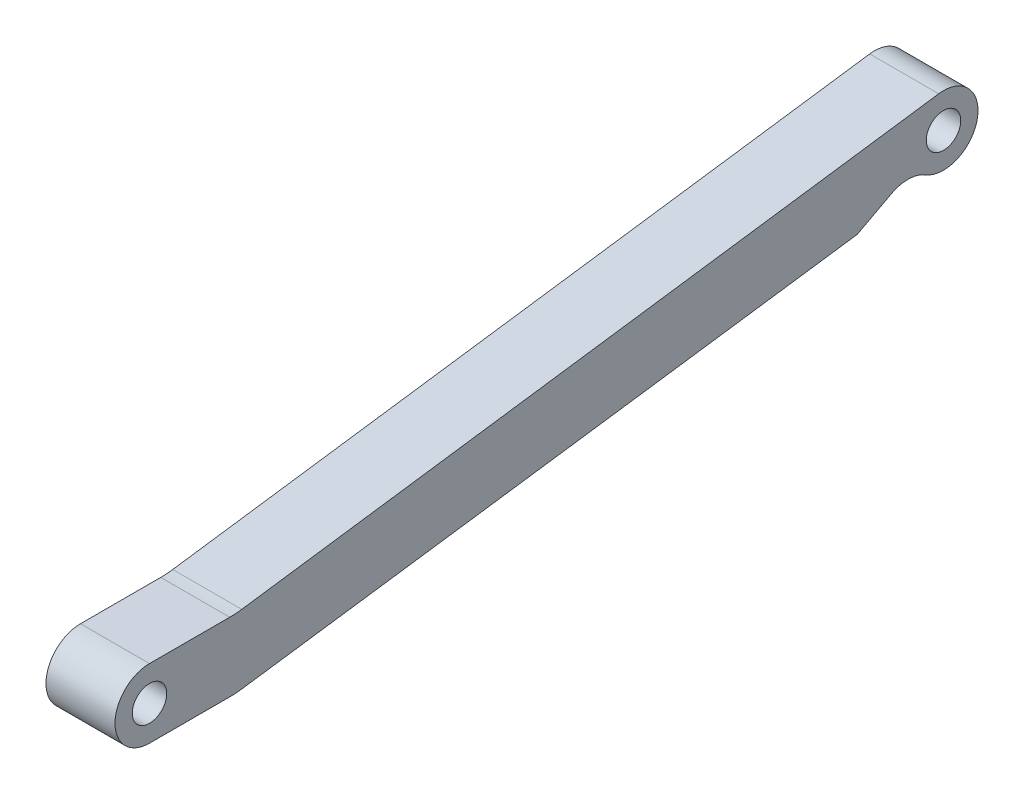
ISO-10303-21;
HEADER;
FILE_DESCRIPTION(('STEP AP214'),'2;1');
FILE_NAME('part.step','',(''),(''),'','','');
FILE_SCHEMA(('AUTOMOTIVE_DESIGN { 1 0 10303 214 1 1 1 1 }'));
ENDSEC;
DATA;
#1=APPLICATION_CONTEXT('core data for automotive mechanical design processes');
#2=APPLICATION_PROTOCOL_DEFINITION('international standard','automotive_design',2000,#1);
#3=PRODUCT_CONTEXT('',#1,'mechanical');
#4=PRODUCT('Part','Part','',(#3));
#5=PRODUCT_RELATED_PRODUCT_CATEGORY('part','',(#4));
#6=PRODUCT_DEFINITION_FORMATION('','',#4);
#7=PRODUCT_DEFINITION_CONTEXT('part definition',#1,'design');
#8=PRODUCT_DEFINITION('design','',#6,#7);
#9=PRODUCT_DEFINITION_SHAPE('','',#8);
#10=(LENGTH_UNIT() NAMED_UNIT(*) SI_UNIT(.MILLI.,.METRE.));
#11=(NAMED_UNIT(*) PLANE_ANGLE_UNIT() SI_UNIT($,.RADIAN.));
#12=(NAMED_UNIT(*) SI_UNIT($,.STERADIAN.) SOLID_ANGLE_UNIT());
#13=UNCERTAINTY_MEASURE_WITH_UNIT(LENGTH_MEASURE(1.E-05),#10,'distance_accuracy_value','');
#14=(GEOMETRIC_REPRESENTATION_CONTEXT(3) GLOBAL_UNCERTAINTY_ASSIGNED_CONTEXT((#13)) GLOBAL_UNIT_ASSIGNED_CONTEXT((#10,
#11,#12)) REPRESENTATION_CONTEXT('',''));
#15=CARTESIAN_POINT('',(0.,0.,0.));
#16=DIRECTION('',(0.,0.,1.));
#17=DIRECTION('',(1.,0.,0.));
#18=AXIS2_PLACEMENT_3D('',#15,#16,#17);
#19=CARTESIAN_POINT('',(-2.,-1.67510815917789,-43.9613905743819));
#20=DIRECTION('',(1.,0.,0.));
#21=DIRECTION('',(0.,0.,-1.));
#22=AXIS2_PLACEMENT_3D('',#19,#20,#21);
#23=CYLINDRICAL_SURFACE('',#22,2.);
#24=DIRECTION('',(1.,0.,0.));
#25=VECTOR('',#24,1.);
#26=CARTESIAN_POINT('',(-2.,0.037445920411055,-44.9944242255682));
#27=LINE('',#26,#25);
#28=CARTESIAN_POINT('',(-2.,0.037445920411055,-44.9944242255682));
#29=VERTEX_POINT('',#28);
#30=CARTESIAN_POINT('',(2.,0.037445920411055,-44.9944242255682));
#31=VERTEX_POINT('',#30);
#32=EDGE_CURVE('E41',#29,#31,#27,.T.);
#33=ORIENTED_EDGE('',*,*,#32,.T.);
#34=CARTESIAN_POINT('',(2.,-1.67510815917789,-43.9613905743819));
#35=DIRECTION('',(1.,0.,0.));
#36=DIRECTION('',(0.,0.,-1.));
#37=AXIS2_PLACEMENT_3D('',#34,#35,#36);
#38=CIRCLE('',#37,2.);
#39=CARTESIAN_POINT('',(2.,0.09158203920933,-43.0239441796891));
#40=VERTEX_POINT('',#39);
#41=EDGE_CURVE('E118',#31,#40,#38,.T.);
#42=ORIENTED_EDGE('',*,*,#41,.T.);
#43=DIRECTION('',(1.,0.,0.));
#44=VECTOR('',#43,1.);
#45=CARTESIAN_POINT('',(-2.,0.09158203920933,-43.0239441796891));
#46=LINE('',#45,#44);
#47=CARTESIAN_POINT('',(-2.,0.09158203920933,-43.0239441796891));
#48=VERTEX_POINT('',#47);
#49=EDGE_CURVE('E11',#48,#40,#46,.T.);
#50=ORIENTED_EDGE('',*,*,#49,.F.);
#51=CARTESIAN_POINT('',(-2.,-1.67510815917789,-43.9613905743819));
#52=DIRECTION('',(1.,0.,0.));
#53=DIRECTION('',(0.,0.,-1.));
#54=AXIS2_PLACEMENT_3D('',#51,#52,#53);
#55=CIRCLE('',#54,2.);
#56=EDGE_CURVE('E54',#29,#48,#55,.T.);
#57=ORIENTED_EDGE('',*,*,#56,.F.);
#58=EDGE_LOOP('',(#33,#42,#50,#57));
#59=FACE_BOUND('',#58,.T.);
#60=ADVANCED_FACE('F38',(#59),#23,.F.);
#61=CARTESIAN_POINT('',(-2.,-17.7423592062854,-9.41450328216023));
#62=DIRECTION('',(0.,-0.88334509919361,-0.468723197346398));
#63=DIRECTION('',(0.,0.468723197346398,-0.88334509919361));
#64=AXIS2_PLACEMENT_3D('',#61,#62,#63);
#65=PLANE('',#64);
#66=ORIENTED_EDGE('',*,*,#49,.T.);
#67=DIRECTION('',(0.,0.468723197346398,-0.88334509919361));
#68=VECTOR('',#67,1.);
#69=CARTESIAN_POINT('',(2.,-17.7423592062854,-9.41450328216023));
#70=LINE('',#69,#68);
#71=CARTESIAN_POINT('',(2.,-0.967799446264573,-41.0274578767545));
#72=VERTEX_POINT('',#71);
#73=EDGE_CURVE('E136',#72,#40,#70,.T.);
#74=ORIENTED_EDGE('',*,*,#73,.F.);
#75=DIRECTION('',(1.,0.,0.));
#76=VECTOR('',#75,1.);
#77=CARTESIAN_POINT('',(-2.,-0.967799446264573,-41.0274578767545));
#78=LINE('',#77,#76);
#79=CARTESIAN_POINT('',(-2.,-0.967799446264573,-41.0274578767545));
#80=VERTEX_POINT('',#79);
#81=EDGE_CURVE('E46',#80,#72,#78,.T.);
#82=ORIENTED_EDGE('',*,*,#81,.F.);
#83=DIRECTION('',(0.,0.468723197346398,-0.88334509919361));
#84=VECTOR('',#83,1.);
#85=CARTESIAN_POINT('',(-2.,-17.7423592062854,-9.41450328216023));
#86=LINE('',#85,#84);
#87=EDGE_CURVE('E184',#80,#48,#86,.T.);
#88=ORIENTED_EDGE('',*,*,#87,.T.);
#89=EDGE_LOOP('',(#66,#74,#82,#88));
#90=FACE_BOUND('',#89,.T.);
#91=ADVANCED_FACE('F233',(#90),#65,.T.);
#92=CARTESIAN_POINT('',(-2.,-6.57020197806449,-0.91770488346063));
#93=DIRECTION('',(0.,-0.990385646456113,-0.138333912305362));
#94=DIRECTION('',(0.,0.138333912305362,-0.990385646456113));
#95=AXIS2_PLACEMENT_3D('',#92,#93,#94);
#96=PLANE('',#95);
#97=ORIENTED_EDGE('',*,*,#81,.T.);
#98=DIRECTION('',(0.,0.138333912305362,-0.990385646456113));
#99=VECTOR('',#98,1.);
#100=CARTESIAN_POINT('',(2.,-6.57020197806449,-0.91770488346063));
#101=LINE('',#100,#99);
#102=CARTESIAN_POINT('',(2.,-5.95192823228057,-5.34416426135625));
#103=VERTEX_POINT('',#102);
#104=EDGE_CURVE('E155',#103,#72,#101,.T.);
#105=ORIENTED_EDGE('',*,*,#104,.F.);
#106=DIRECTION('',(1.,0.,0.));
#107=VECTOR('',#106,1.);
#108=CARTESIAN_POINT('',(-2.,-5.95192823228057,-5.34416426135625));
#109=LINE('',#108,#107);
#110=CARTESIAN_POINT('',(-2.,-5.95192823228057,-5.34416426135625));
#111=VERTEX_POINT('',#110);
#112=EDGE_CURVE('E192',#111,#103,#109,.T.);
#113=ORIENTED_EDGE('',*,*,#112,.F.);
#114=DIRECTION('',(0.,0.138333912305362,-0.990385646456113));
#115=VECTOR('',#114,1.);
#116=CARTESIAN_POINT('',(-2.,-6.57020197806449,-0.91770488346063));
#117=LINE('',#116,#115);
#118=EDGE_CURVE('E182',#111,#80,#117,.T.);
#119=ORIENTED_EDGE('',*,*,#118,.T.);
#120=EDGE_LOOP('',(#97,#105,#113,#119));
#121=FACE_BOUND('',#120,.T.);
#122=ADVANCED_FACE('F231',(#121),#96,.T.);
#123=CARTESIAN_POINT('',(-2.,-1.,-4.65249469982944));
#124=DIRECTION('',(1.,0.,0.));
#125=DIRECTION('',(0.,0.,-1.));
#126=AXIS2_PLACEMENT_3D('',#123,#124,#125);
#127=CYLINDRICAL_SURFACE('',#126,5.);
#128=ORIENTED_EDGE('',*,*,#112,.T.);
#129=CARTESIAN_POINT('',(2.,-1.,-4.65249469982944));
#130=DIRECTION('',(1.,0.,0.));
#131=DIRECTION('',(0.,0.,-1.));
#132=AXIS2_PLACEMENT_3D('',#129,#130,#131);
#133=CIRCLE('',#132,5.);
#134=CARTESIAN_POINT('',(2.,-6.,-4.65249469982944));
#135=VERTEX_POINT('',#134);
#136=EDGE_CURVE('E152',#135,#103,#133,.T.);
#137=ORIENTED_EDGE('',*,*,#136,.F.);
#138=DIRECTION('',(1.,0.,0.));
#139=VECTOR('',#138,1.);
#140=CARTESIAN_POINT('',(-2.,-6.,-4.65249469982944));
#141=LINE('',#140,#139);
#142=CARTESIAN_POINT('',(-2.,-6.,-4.65249469982944));
#143=VERTEX_POINT('',#142);
#144=EDGE_CURVE('E194',#143,#135,#141,.T.);
#145=ORIENTED_EDGE('',*,*,#144,.F.);
#146=CARTESIAN_POINT('',(-2.,-1.,-4.65249469982944));
#147=DIRECTION('',(1.,0.,0.));
#148=DIRECTION('',(0.,0.,-1.));
#149=AXIS2_PLACEMENT_3D('',#146,#147,#148);
#150=CIRCLE('',#149,5.);
#151=EDGE_CURVE('E179',#143,#111,#150,.T.);
#152=ORIENTED_EDGE('',*,*,#151,.T.);
#153=EDGE_LOOP('',(#128,#137,#145,#152));
#154=FACE_BOUND('',#153,.T.);
#155=ADVANCED_FACE('F226',(#154),#127,.T.);
#156=CARTESIAN_POINT('',(-2.,-6.,0.));
#157=DIRECTION('',(0.,-1.,0.));
#158=DIRECTION('',(0.,0.,-1.));
#159=AXIS2_PLACEMENT_3D('',#156,#157,#158);
#160=PLANE('',#159);
#161=ORIENTED_EDGE('',*,*,#144,.T.);
#162=DIRECTION('',(0.,0.,-1.));
#163=VECTOR('',#162,1.);
#164=CARTESIAN_POINT('',(2.,-6.,0.));
#165=LINE('',#164,#163);
#166=CARTESIAN_POINT('',(2.,-6.,0.));
#167=VERTEX_POINT('',#166);
#168=EDGE_CURVE('E149',#167,#135,#165,.T.);
#169=ORIENTED_EDGE('',*,*,#168,.F.);
#170=DIRECTION('',(1.,0.,0.));
#171=VECTOR('',#170,1.);
#172=CARTESIAN_POINT('',(-2.,-6.,0.));
#173=LINE('',#172,#171);
#174=CARTESIAN_POINT('',(-2.,-6.,0.));
#175=VERTEX_POINT('',#174);
#176=EDGE_CURVE('E196',#175,#167,#173,.T.);
#177=ORIENTED_EDGE('',*,*,#176,.F.);
#178=DIRECTION('',(0.,0.,-1.));
#179=VECTOR('',#178,1.);
#180=CARTESIAN_POINT('',(-2.,-6.,0.));
#181=LINE('',#180,#179);
#182=EDGE_CURVE('E176',#175,#143,#181,.T.);
#183=ORIENTED_EDGE('',*,*,#182,.T.);
#184=EDGE_LOOP('',(#161,#169,#177,#183));
#185=FACE_BOUND('',#184,.T.);
#186=ADVANCED_FACE('F222',(#185),#160,.T.);
#187=CARTESIAN_POINT('',(-2.,-4.,0.));
#188=DIRECTION('',(1.,0.,0.));
#189=DIRECTION('',(0.,0.,-1.));
#190=AXIS2_PLACEMENT_3D('',#187,#188,#189);
#191=CYLINDRICAL_SURFACE('',#190,2.);
#192=ORIENTED_EDGE('',*,*,#176,.T.);
#193=CARTESIAN_POINT('',(2.,-4.,0.));
#194=DIRECTION('',(1.,0.,0.));
#195=DIRECTION('',(0.,0.,-1.));
#196=AXIS2_PLACEMENT_3D('',#193,#194,#195);
#197=CIRCLE('',#196,2.);
#198=CARTESIAN_POINT('',(2.,-2.,0.));
#199=VERTEX_POINT('',#198);
#200=EDGE_CURVE('E146',#199,#167,#197,.T.);
#201=ORIENTED_EDGE('',*,*,#200,.F.);
#202=DIRECTION('',(1.,0.,0.));
#203=VECTOR('',#202,1.);
#204=CARTESIAN_POINT('',(-2.,-2.,0.));
#205=LINE('',#204,#203);
#206=CARTESIAN_POINT('',(-2.,-2.,0.));
#207=VERTEX_POINT('',#206);
#208=EDGE_CURVE('E198',#207,#199,#205,.T.);
#209=ORIENTED_EDGE('',*,*,#208,.F.);
#210=CARTESIAN_POINT('',(-2.,-4.,0.));
#211=DIRECTION('',(1.,0.,0.));
#212=DIRECTION('',(0.,0.,-1.));
#213=AXIS2_PLACEMENT_3D('',#210,#211,#212);
#214=CIRCLE('',#213,2.);
#215=EDGE_CURVE('E173',#207,#175,#214,.T.);
#216=ORIENTED_EDGE('',*,*,#215,.T.);
#217=EDGE_LOOP('',(#192,#201,#209,#216));
#218=FACE_BOUND('',#217,.T.);
#219=ADVANCED_FACE('F249',(#218),#191,.T.);
#220=CARTESIAN_POINT('',(-2.,-2.,0.));
#221=DIRECTION('',(0.,-1.,0.));
#222=DIRECTION('',(0.,0.,-1.));
#223=AXIS2_PLACEMENT_3D('',#220,#221,#222);
#224=PLANE('',#223);
#225=ORIENTED_EDGE('',*,*,#208,.T.);
#226=DIRECTION('',(0.,0.,-1.));
#227=VECTOR('',#226,1.);
#228=CARTESIAN_POINT('',(2.,-2.,0.));
#229=LINE('',#228,#227);
#230=CARTESIAN_POINT('',(2.,-2.,-4.65014696881731));
#231=VERTEX_POINT('',#230);
#232=EDGE_CURVE('E143',#199,#231,#229,.T.);
#233=ORIENTED_EDGE('',*,*,#232,.T.);
#234=DIRECTION('',(1.,0.,0.));
#235=VECTOR('',#234,1.);
#236=CARTESIAN_POINT('',(-2.,-2.,-4.65014696881731));
#237=LINE('',#236,#235);
#238=CARTESIAN_POINT('',(-2.,-2.,-4.65014696881731));
#239=VERTEX_POINT('',#238);
#240=EDGE_CURVE('E200',#239,#231,#237,.T.);
#241=ORIENTED_EDGE('',*,*,#240,.F.);
#242=DIRECTION('',(0.,0.,-1.));
#243=VECTOR('',#242,1.);
#244=CARTESIAN_POINT('',(-2.,-2.,0.));
#245=LINE('',#244,#243);
#246=EDGE_CURVE('E171',#207,#239,#245,.T.);
#247=ORIENTED_EDGE('',*,*,#246,.F.);
#248=EDGE_LOOP('',(#225,#233,#241,#247));
#249=FACE_BOUND('',#248,.T.);
#250=ADVANCED_FACE('F215',(#249),#224,.F.);
#251=CARTESIAN_POINT('',(-2.,3.,-4.65014696881731));
#252=DIRECTION('',(1.,0.,0.));
#253=DIRECTION('',(0.,0.,-1.));
#254=AXIS2_PLACEMENT_3D('',#251,#252,#253);
#255=CYLINDRICAL_SURFACE('',#254,5.);
#256=ORIENTED_EDGE('',*,*,#240,.T.);
#257=CARTESIAN_POINT('',(2.,3.,-4.65014696881731));
#258=DIRECTION('',(1.,0.,0.));
#259=DIRECTION('',(0.,0.,-1.));
#260=AXIS2_PLACEMENT_3D('',#257,#258,#259);
#261=CIRCLE('',#260,5.);
#262=CARTESIAN_POINT('',(2.,-1.95127967178893,-5.3464440402816));
#263=VERTEX_POINT('',#262);
#264=EDGE_CURVE('E140',#231,#263,#261,.T.);
#265=ORIENTED_EDGE('',*,*,#264,.T.);
#266=DIRECTION('',(1.,0.,0.));
#267=VECTOR('',#266,1.);
#268=CARTESIAN_POINT('',(-2.,-1.95127967178893,-5.3464440402816));
#269=LINE('',#268,#267);
#270=CARTESIAN_POINT('',(-2.,-1.95127967178893,-5.3464440402816));
#271=VERTEX_POINT('',#270);
#272=EDGE_CURVE('E202',#271,#263,#269,.T.);
#273=ORIENTED_EDGE('',*,*,#272,.F.);
#274=CARTESIAN_POINT('',(-2.,3.,-4.65014696881731));
#275=DIRECTION('',(1.,0.,0.));
#276=DIRECTION('',(0.,0.,-1.));
#277=AXIS2_PLACEMENT_3D('',#274,#275,#276);
#278=CIRCLE('',#277,5.);
#279=EDGE_CURVE('E169',#239,#271,#278,.T.);
#280=ORIENTED_EDGE('',*,*,#279,.F.);
#281=EDGE_LOOP('',(#256,#265,#273,#280));
#282=FACE_BOUND('',#281,.T.);
#283=ADVANCED_FACE('F211',(#282),#255,.F.);
#284=CARTESIAN_POINT('',(-2.,-2.65072593815507,-0.37277084518333));
#285=DIRECTION('',(0.,-0.990255934357785,-0.139259414292857));
#286=DIRECTION('',(0.,0.139259414292857,-0.990255934357785));
#287=AXIS2_PLACEMENT_3D('',#284,#285,#286);
#288=PLANE('',#287);
#289=ORIENTED_EDGE('',*,*,#272,.T.);
#290=DIRECTION('',(0.,0.139259414292857,-0.990255934357785));
#291=VECTOR('',#290,1.);
#292=CARTESIAN_POINT('',(2.,-2.65072593815507,-0.37277084518333));
#293=LINE('',#292,#291);
#294=CARTESIAN_POINT('',(2.,3.73051186871558,-45.7489390481688));
#295=VERTEX_POINT('',#294);
#296=EDGE_CURVE('E130',#263,#295,#293,.T.);
#297=ORIENTED_EDGE('',*,*,#296,.T.);
#298=DIRECTION('',(1.,0.,0.));
#299=VECTOR('',#298,1.);
#300=CARTESIAN_POINT('',(-2.,3.73051186871558,-45.7489390481688));
#301=LINE('',#300,#299);
#302=CARTESIAN_POINT('',(-2.,3.73051186871558,-45.7489390481688));
#303=VERTEX_POINT('',#302);
#304=EDGE_CURVE('E121',#303,#295,#301,.T.);
#305=ORIENTED_EDGE('',*,*,#304,.F.);
#306=DIRECTION('',(0.,0.139259414292857,-0.990255934357785));
#307=VECTOR('',#306,1.);
#308=CARTESIAN_POINT('',(-2.,-2.65072593815507,-0.37277084518333));
#309=LINE('',#308,#307);
#310=EDGE_CURVE('E167',#271,#303,#309,.T.);
#311=ORIENTED_EDGE('',*,*,#310,.F.);
#312=EDGE_LOOP('',(#289,#297,#305,#311));
#313=FACE_BOUND('',#312,.T.);
#314=ADVANCED_FACE('F206',(#313),#288,.F.);
#315=CARTESIAN_POINT('',(-2.,-4.,0.));
#316=DIRECTION('',(1.,0.,0.));
#317=DIRECTION('',(0.,0.,-1.));
#318=AXIS2_PLACEMENT_3D('',#315,#316,#317);
#319=CYLINDRICAL_SURFACE('',#318,1.);
#320=CARTESIAN_POINT('',(-2.,-4.,0.));
#321=DIRECTION('',(1.,0.,0.));
#322=DIRECTION('',(0.,0.,-1.));
#323=AXIS2_PLACEMENT_3D('',#320,#321,#322);
#324=CIRCLE('',#323,1.);
#325=CARTESIAN_POINT('',(-2.,-4.,-0.999999999999951));
#326=VERTEX_POINT('',#325);
#327=EDGE_CURVE('E186',#326,#326,#324,.T.);
#328=ORIENTED_EDGE('',*,*,#327,.F.);
#329=EDGE_LOOP('',(#328));
#330=FACE_BOUND('',#329,.T.);
#331=CARTESIAN_POINT('',(2.,-4.,0.));
#332=DIRECTION('',(1.,0.,0.));
#333=DIRECTION('',(0.,0.,-1.));
#334=AXIS2_PLACEMENT_3D('',#331,#332,#333);
#335=CIRCLE('',#334,1.);
#336=CARTESIAN_POINT('',(2.,-4.,-0.999999999999951));
#337=VERTEX_POINT('',#336);
#338=EDGE_CURVE('E158',#337,#337,#335,.T.);
#339=ORIENTED_EDGE('',*,*,#338,.T.);
#340=EDGE_LOOP('',(#339));
#341=FACE_BOUND('',#340,.T.);
#342=ADVANCED_FACE('F242',(#330,#341),#319,.F.);
#343=CARTESIAN_POINT('',(-2.,1.75,-46.0274578767545));
#344=DIRECTION('',(1.,0.,0.));
#345=DIRECTION('',(0.,0.,-1.));
#346=AXIS2_PLACEMENT_3D('',#343,#344,#345);
#347=CYLINDRICAL_SURFACE('',#346,2.);
#348=ORIENTED_EDGE('',*,*,#304,.T.);
#349=CARTESIAN_POINT('',(2.,1.75,-46.0274578767545));
#350=DIRECTION('',(1.,0.,0.));
#351=DIRECTION('',(0.,0.,-1.));
#352=AXIS2_PLACEMENT_3D('',#349,#350,#351);
#353=CIRCLE('',#352,2.);
#354=EDGE_CURVE('E124',#31,#295,#353,.T.);
#355=ORIENTED_EDGE('',*,*,#354,.F.);
#356=ORIENTED_EDGE('',*,*,#32,.F.);
#357=CARTESIAN_POINT('',(-2.,1.75,-46.0274578767545));
#358=DIRECTION('',(1.,0.,0.));
#359=DIRECTION('',(0.,0.,-1.));
#360=AXIS2_PLACEMENT_3D('',#357,#358,#359);
#361=CIRCLE('',#360,2.);
#362=EDGE_CURVE('E165',#29,#303,#361,.T.);
#363=ORIENTED_EDGE('',*,*,#362,.T.);
#364=EDGE_LOOP('',(#348,#355,#356,#363));
#365=FACE_BOUND('',#364,.T.);
#366=ADVANCED_FACE('F125',(#365),#347,.T.);
#367=CARTESIAN_POINT('',(-2.,1.75,-46.0274578767545));
#368=DIRECTION('',(1.,0.,0.));
#369=DIRECTION('',(0.,0.,-1.));
#370=AXIS2_PLACEMENT_3D('',#367,#368,#369);
#371=CYLINDRICAL_SURFACE('',#370,0.999999999999998);
#372=CARTESIAN_POINT('',(-2.,1.75,-46.0274578767545));
#373=DIRECTION('',(1.,0.,0.));
#374=DIRECTION('',(0.,0.,-1.));
#375=AXIS2_PLACEMENT_3D('',#372,#373,#374);
#376=CIRCLE('',#375,0.999999999999998);
#377=CARTESIAN_POINT('',(-2.,1.75,-47.0274578767545));
#378=VERTEX_POINT('',#377);
#379=EDGE_CURVE('E122',#378,#378,#376,.T.);
#380=ORIENTED_EDGE('',*,*,#379,.F.);
#381=EDGE_LOOP('',(#380));
#382=FACE_BOUND('',#381,.T.);
#383=CARTESIAN_POINT('',(2.,1.75,-46.0274578767545));
#384=DIRECTION('',(1.,0.,0.));
#385=DIRECTION('',(0.,0.,-1.));
#386=AXIS2_PLACEMENT_3D('',#383,#384,#385);
#387=CIRCLE('',#386,0.999999999999998);
#388=CARTESIAN_POINT('',(2.,1.75,-47.0274578767545));
#389=VERTEX_POINT('',#388);
#390=EDGE_CURVE('E161',#389,#389,#387,.T.);
#391=ORIENTED_EDGE('',*,*,#390,.T.);
#392=EDGE_LOOP('',(#391));
#393=FACE_BOUND('',#392,.T.);
#394=ADVANCED_FACE('F258',(#382,#393),#371,.F.);
#395=CARTESIAN_POINT('',(-2.,0.,0.));
#396=DIRECTION('',(1.,0.,0.));
#397=DIRECTION('',(0.,0.,-1.));
#398=AXIS2_PLACEMENT_3D('',#395,#396,#397);
#399=PLANE('',#398);
#400=ORIENTED_EDGE('',*,*,#56,.T.);
#401=ORIENTED_EDGE('',*,*,#87,.F.);
#402=ORIENTED_EDGE('',*,*,#118,.F.);
#403=ORIENTED_EDGE('',*,*,#151,.F.);
#404=ORIENTED_EDGE('',*,*,#182,.F.);
#405=ORIENTED_EDGE('',*,*,#215,.F.);
#406=ORIENTED_EDGE('',*,*,#246,.T.);
#407=ORIENTED_EDGE('',*,*,#279,.T.);
#408=ORIENTED_EDGE('',*,*,#310,.T.);
#409=ORIENTED_EDGE('',*,*,#362,.F.);
#410=EDGE_LOOP('',(#400,#401,#402,#403,#404,#405,#406,#407,#408,#409));
#411=FACE_BOUND('',#410,.T.);
#412=ORIENTED_EDGE('',*,*,#327,.T.);
#413=EDGE_LOOP('',(#412));
#414=FACE_BOUND('',#413,.T.);
#415=ORIENTED_EDGE('',*,*,#379,.T.);
#416=EDGE_LOOP('',(#415));
#417=FACE_BOUND('',#416,.T.);
#418=ADVANCED_FACE('F228',(#411,#414,#417),#399,.F.);
#419=CARTESIAN_POINT('',(2.,0.,0.));
#420=DIRECTION('',(1.,0.,0.));
#421=DIRECTION('',(0.,0.,-1.));
#422=AXIS2_PLACEMENT_3D('',#419,#420,#421);
#423=PLANE('',#422);
#424=ORIENTED_EDGE('',*,*,#41,.F.);
#425=ORIENTED_EDGE('',*,*,#354,.T.);
#426=ORIENTED_EDGE('',*,*,#296,.F.);
#427=ORIENTED_EDGE('',*,*,#264,.F.);
#428=ORIENTED_EDGE('',*,*,#232,.F.);
#429=ORIENTED_EDGE('',*,*,#200,.T.);
#430=ORIENTED_EDGE('',*,*,#168,.T.);
#431=ORIENTED_EDGE('',*,*,#136,.T.);
#432=ORIENTED_EDGE('',*,*,#104,.T.);
#433=ORIENTED_EDGE('',*,*,#73,.T.);
#434=EDGE_LOOP('',(#424,#425,#426,#427,#428,#429,#430,#431,#432,#433));
#435=FACE_BOUND('',#434,.T.);
#436=ORIENTED_EDGE('',*,*,#338,.F.);
#437=EDGE_LOOP('',(#436));
#438=FACE_BOUND('',#437,.T.);
#439=ORIENTED_EDGE('',*,*,#390,.F.);
#440=EDGE_LOOP('',(#439));
#441=FACE_BOUND('',#440,.T.);
#442=ADVANCED_FACE('F133',(#435,#438,#441),#423,.T.);
#443=CLOSED_SHELL('',(#60,#91,#122,#155,#186,#219,#250,#283,#314,#342,#366,#394,#418,#442));
#444=MANIFOLD_SOLID_BREP('B2',#443);
#445=ADVANCED_BREP_SHAPE_REPRESENTATION('',(#18,#444),#14);
#446=SHAPE_DEFINITION_REPRESENTATION(#9,#445);
ENDSEC;
END-ISO-10303-21;
